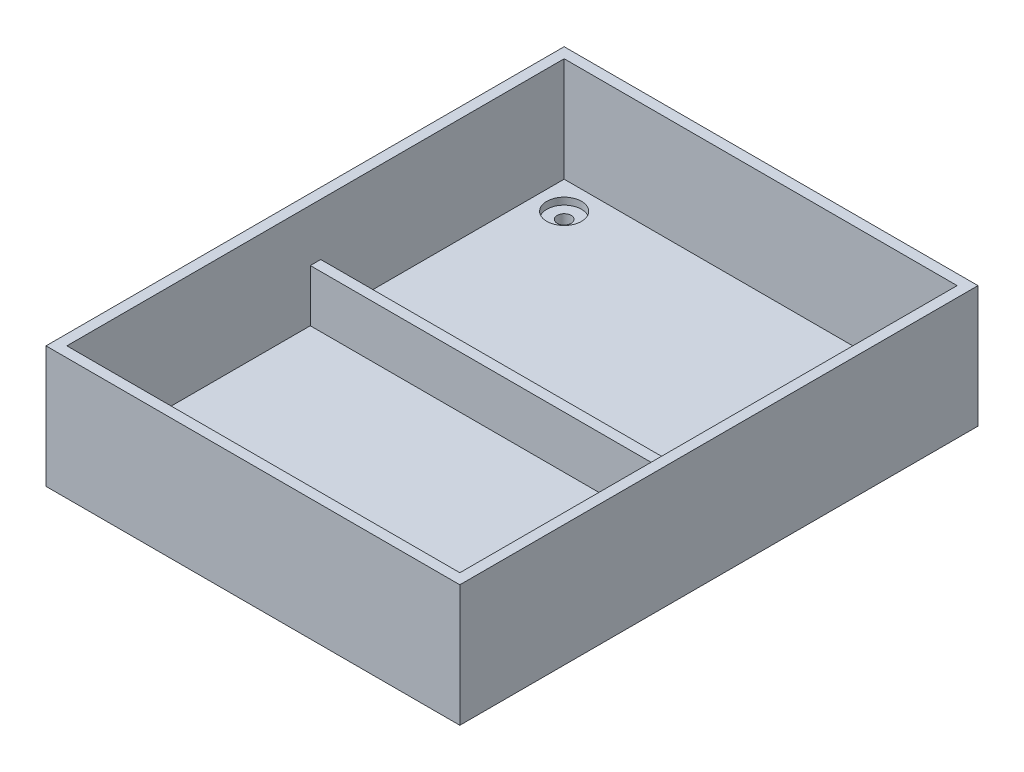
ISO-10303-21;
HEADER;
FILE_DESCRIPTION(('STEP AP214'),'2;1');
FILE_NAME('part.step','',(''),(''),'','','');
FILE_SCHEMA(('AUTOMOTIVE_DESIGN { 1 0 10303 214 1 1 1 1 }'));
ENDSEC;
DATA;
#1=APPLICATION_CONTEXT('core data for automotive mechanical design processes');
#2=APPLICATION_PROTOCOL_DEFINITION('international standard','automotive_design',2000,#1);
#3=PRODUCT_CONTEXT('',#1,'mechanical');
#4=PRODUCT('Part','Part','',(#3));
#5=PRODUCT_RELATED_PRODUCT_CATEGORY('part','',(#4));
#6=PRODUCT_DEFINITION_FORMATION('','',#4);
#7=PRODUCT_DEFINITION_CONTEXT('part definition',#1,'design');
#8=PRODUCT_DEFINITION('design','',#6,#7);
#9=PRODUCT_DEFINITION_SHAPE('','',#8);
#10=(LENGTH_UNIT() NAMED_UNIT(*) SI_UNIT(.MILLI.,.METRE.));
#11=(NAMED_UNIT(*) PLANE_ANGLE_UNIT() SI_UNIT($,.RADIAN.));
#12=(NAMED_UNIT(*) SI_UNIT($,.STERADIAN.) SOLID_ANGLE_UNIT());
#13=UNCERTAINTY_MEASURE_WITH_UNIT(LENGTH_MEASURE(1.E-05),#10,'distance_accuracy_value','');
#14=(GEOMETRIC_REPRESENTATION_CONTEXT(3) GLOBAL_UNCERTAINTY_ASSIGNED_CONTEXT((#13)) GLOBAL_UNIT_ASSIGNED_CONTEXT((#10,
#11,#12)) REPRESENTATION_CONTEXT('',''));
#15=CARTESIAN_POINT('',(0.,0.,0.));
#16=DIRECTION('',(0.,0.,1.));
#17=DIRECTION('',(1.,0.,0.));
#18=AXIS2_PLACEMENT_3D('',#15,#16,#17);
#19=CARTESIAN_POINT('',(-63.5,35.,35.));
#20=DIRECTION('',(0.,0.,-1.));
#21=DIRECTION('',(-1.,0.,0.));
#22=AXIS2_PLACEMENT_3D('',#19,#20,#21);
#23=PLANE('',#22);
#24=DIRECTION('',(0.,-1.,0.));
#25=VECTOR('',#24,1.);
#26=CARTESIAN_POINT('',(-63.5,35.,35.));
#27=LINE('',#26,#25);
#28=CARTESIAN_POINT('',(-63.5,20.,35.));
#29=VERTEX_POINT('',#28);
#30=CARTESIAN_POINT('',(-63.5,5.,35.));
#31=VERTEX_POINT('',#30);
#32=EDGE_CURVE('E200',#29,#31,#27,.T.);
#33=ORIENTED_EDGE('',*,*,#32,.F.);
#34=DIRECTION('',(-1.,0.,0.));
#35=VECTOR('',#34,1.);
#36=CARTESIAN_POINT('',(-63.5,20.,35.));
#37=LINE('',#36,#35);
#38=CARTESIAN_POINT('',(49.5,20.,35.));
#39=VERTEX_POINT('',#38);
#40=EDGE_CURVE('E139',#39,#29,#37,.T.);
#41=ORIENTED_EDGE('',*,*,#40,.F.);
#42=DIRECTION('',(0.,-1.,0.));
#43=VECTOR('',#42,1.);
#44=CARTESIAN_POINT('',(49.5,35.,35.));
#45=LINE('',#44,#43);
#46=CARTESIAN_POINT('',(49.5,5.,35.));
#47=VERTEX_POINT('',#46);
#48=EDGE_CURVE('E136',#39,#47,#45,.T.);
#49=ORIENTED_EDGE('',*,*,#48,.T.);
#50=DIRECTION('',(1.,0.,0.));
#51=VECTOR('',#50,1.);
#52=CARTESIAN_POINT('',(-63.5,5.,35.));
#53=LINE('',#52,#51);
#54=EDGE_CURVE('E182',#31,#47,#53,.T.);
#55=ORIENTED_EDGE('',*,*,#54,.F.);
#56=EDGE_LOOP('',(#33,#41,#49,#55));
#57=FACE_BOUND('',#56,.T.);
#58=ADVANCED_FACE('F36',(#57),#23,.T.);
#59=CARTESIAN_POINT('',(-63.5,35.,38.));
#60=DIRECTION('',(0.,0.,1.));
#61=DIRECTION('',(1.,0.,0.));
#62=AXIS2_PLACEMENT_3D('',#59,#60,#61);
#63=PLANE('',#62);
#64=DIRECTION('',(0.,-1.,0.));
#65=VECTOR('',#64,1.);
#66=CARTESIAN_POINT('',(49.5,35.,38.));
#67=LINE('',#66,#65);
#68=CARTESIAN_POINT('',(49.5,20.,38.));
#69=VERTEX_POINT('',#68);
#70=CARTESIAN_POINT('',(49.5,5.,38.));
#71=VERTEX_POINT('',#70);
#72=EDGE_CURVE('E134',#69,#71,#67,.T.);
#73=ORIENTED_EDGE('',*,*,#72,.F.);
#74=DIRECTION('',(1.,0.,0.));
#75=VECTOR('',#74,1.);
#76=CARTESIAN_POINT('',(-63.5,20.,38.));
#77=LINE('',#76,#75);
#78=CARTESIAN_POINT('',(-63.5,20.,38.));
#79=VERTEX_POINT('',#78);
#80=EDGE_CURVE('E140',#79,#69,#77,.T.);
#81=ORIENTED_EDGE('',*,*,#80,.F.);
#82=DIRECTION('',(0.,-1.,0.));
#83=VECTOR('',#82,1.);
#84=CARTESIAN_POINT('',(-63.5,35.,38.));
#85=LINE('',#84,#83);
#86=CARTESIAN_POINT('',(-63.5,5.,38.));
#87=VERTEX_POINT('',#86);
#88=EDGE_CURVE('E153',#79,#87,#85,.T.);
#89=ORIENTED_EDGE('',*,*,#88,.T.);
#90=DIRECTION('',(-1.,0.,0.));
#91=VECTOR('',#90,1.);
#92=CARTESIAN_POINT('',(-63.5,5.,38.));
#93=LINE('',#92,#91);
#94=EDGE_CURVE('E149',#71,#87,#93,.T.);
#95=ORIENTED_EDGE('',*,*,#94,.F.);
#96=EDGE_LOOP('',(#73,#81,#89,#95));
#97=FACE_BOUND('',#96,.T.);
#98=ADVANCED_FACE('F147',(#97),#63,.T.);
#99=CARTESIAN_POINT('',(-66.5,5.,-38.));
#100=DIRECTION('',(0.,0.,1.));
#101=DIRECTION('',(1.,0.,0.));
#102=AXIS2_PLACEMENT_3D('',#99,#100,#101);
#103=PLANE('',#102);
#104=DIRECTION('',(-1.,0.,0.));
#105=VECTOR('',#104,1.);
#106=CARTESIAN_POINT('',(-66.5,0.,-38.));
#107=LINE('',#106,#105);
#108=CARTESIAN_POINT('',(52.5,0.,-38.));
#109=VERTEX_POINT('',#108);
#110=CARTESIAN_POINT('',(-66.5,0.,-38.));
#111=VERTEX_POINT('',#110);
#112=EDGE_CURVE('E219',#109,#111,#107,.T.);
#113=ORIENTED_EDGE('',*,*,#112,.T.);
#114=DIRECTION('',(0.,-1.,0.));
#115=VECTOR('',#114,1.);
#116=CARTESIAN_POINT('',(-66.5,5.,-38.));
#117=LINE('',#116,#115);
#118=CARTESIAN_POINT('',(-66.5,35.,-38.));
#119=VERTEX_POINT('',#118);
#120=EDGE_CURVE('E11',#119,#111,#117,.T.);
#121=ORIENTED_EDGE('',*,*,#120,.F.);
#122=DIRECTION('',(-1.,0.,0.));
#123=VECTOR('',#122,1.);
#124=CARTESIAN_POINT('',(-66.5,35.,-38.));
#125=LINE('',#124,#123);
#126=CARTESIAN_POINT('',(52.5,35.,-38.));
#127=VERTEX_POINT('',#126);
#128=EDGE_CURVE('E215',#127,#119,#125,.T.);
#129=ORIENTED_EDGE('',*,*,#128,.F.);
#130=DIRECTION('',(0.,-1.,0.));
#131=VECTOR('',#130,1.);
#132=CARTESIAN_POINT('',(52.5,5.,-38.));
#133=LINE('',#132,#131);
#134=EDGE_CURVE('E232',#127,#109,#133,.T.);
#135=ORIENTED_EDGE('',*,*,#134,.T.);
#136=EDGE_LOOP('',(#113,#121,#129,#135));
#137=FACE_BOUND('',#136,.T.);
#138=ADVANCED_FACE('F38',(#137),#103,.F.);
#139=CARTESIAN_POINT('',(-66.5,5.,111.));
#140=DIRECTION('',(1.,0.,0.));
#141=DIRECTION('',(0.,0.,-1.));
#142=AXIS2_PLACEMENT_3D('',#139,#140,#141);
#143=PLANE('',#142);
#144=DIRECTION('',(0.,0.,1.));
#145=VECTOR('',#144,1.);
#146=CARTESIAN_POINT('',(-66.5,0.,111.));
#147=LINE('',#146,#145);
#148=CARTESIAN_POINT('',(-66.5,0.,111.));
#149=VERTEX_POINT('',#148);
#150=EDGE_CURVE('E223',#111,#149,#147,.T.);
#151=ORIENTED_EDGE('',*,*,#150,.T.);
#152=DIRECTION('',(0.,-1.,0.));
#153=VECTOR('',#152,1.);
#154=CARTESIAN_POINT('',(-66.5,5.,111.));
#155=LINE('',#154,#153);
#156=CARTESIAN_POINT('',(-66.5,35.,111.));
#157=VERTEX_POINT('',#156);
#158=EDGE_CURVE('E46',#157,#149,#155,.T.);
#159=ORIENTED_EDGE('',*,*,#158,.F.);
#160=DIRECTION('',(0.,0.,1.));
#161=VECTOR('',#160,1.);
#162=CARTESIAN_POINT('',(-66.5,35.,-38.));
#163=LINE('',#162,#161);
#164=EDGE_CURVE('E203',#119,#157,#163,.T.);
#165=ORIENTED_EDGE('',*,*,#164,.F.);
#166=ORIENTED_EDGE('',*,*,#120,.T.);
#167=EDGE_LOOP('',(#151,#159,#165,#166));
#168=FACE_BOUND('',#167,.T.);
#169=ADVANCED_FACE('F351',(#168),#143,.F.);
#170=CARTESIAN_POINT('',(52.5,5.,111.));
#171=DIRECTION('',(0.,0.,-1.));
#172=DIRECTION('',(-1.,0.,0.));
#173=AXIS2_PLACEMENT_3D('',#170,#171,#172);
#174=PLANE('',#173);
#175=DIRECTION('',(1.,0.,0.));
#176=VECTOR('',#175,1.);
#177=CARTESIAN_POINT('',(52.5,0.,111.));
#178=LINE('',#177,#176);
#179=CARTESIAN_POINT('',(52.5,0.,111.));
#180=VERTEX_POINT('',#179);
#181=EDGE_CURVE('E226',#149,#180,#178,.T.);
#182=ORIENTED_EDGE('',*,*,#181,.T.);
#183=DIRECTION('',(0.,-1.,0.));
#184=VECTOR('',#183,1.);
#185=CARTESIAN_POINT('',(52.5,5.,111.));
#186=LINE('',#185,#184);
#187=CARTESIAN_POINT('',(52.5,35.,111.));
#188=VERTEX_POINT('',#187);
#189=EDGE_CURVE('E236',#188,#180,#186,.T.);
#190=ORIENTED_EDGE('',*,*,#189,.F.);
#191=DIRECTION('',(1.,0.,0.));
#192=VECTOR('',#191,1.);
#193=CARTESIAN_POINT('',(-66.5,35.,111.));
#194=LINE('',#193,#192);
#195=EDGE_CURVE('E207',#157,#188,#194,.T.);
#196=ORIENTED_EDGE('',*,*,#195,.F.);
#197=ORIENTED_EDGE('',*,*,#158,.T.);
#198=EDGE_LOOP('',(#182,#190,#196,#197));
#199=FACE_BOUND('',#198,.T.);
#200=ADVANCED_FACE('F348',(#199),#174,.F.);
#201=CARTESIAN_POINT('',(52.5,5.,-38.));
#202=DIRECTION('',(-1.,0.,0.));
#203=DIRECTION('',(0.,0.,1.));
#204=AXIS2_PLACEMENT_3D('',#201,#202,#203);
#205=PLANE('',#204);
#206=DIRECTION('',(0.,0.,-1.));
#207=VECTOR('',#206,1.);
#208=CARTESIAN_POINT('',(52.5,0.,-38.));
#209=LINE('',#208,#207);
#210=EDGE_CURVE('E229',#180,#109,#209,.T.);
#211=ORIENTED_EDGE('',*,*,#210,.T.);
#212=ORIENTED_EDGE('',*,*,#134,.F.);
#213=DIRECTION('',(0.,0.,-1.));
#214=VECTOR('',#213,1.);
#215=CARTESIAN_POINT('',(52.5,35.,-38.));
#216=LINE('',#215,#214);
#217=EDGE_CURVE('E211',#188,#127,#216,.T.);
#218=ORIENTED_EDGE('',*,*,#217,.F.);
#219=ORIENTED_EDGE('',*,*,#189,.T.);
#220=EDGE_LOOP('',(#211,#212,#218,#219));
#221=FACE_BOUND('',#220,.T.);
#222=ADVANCED_FACE('F344',(#221),#205,.F.);
#223=CARTESIAN_POINT('',(0.,0.,0.));
#224=DIRECTION('',(0.,-1.,0.));
#225=DIRECTION('',(0.,0.,-1.));
#226=AXIS2_PLACEMENT_3D('',#223,#224,#225);
#227=PLANE('',#226);
#228=CARTESIAN_POINT('',(-55.5,0.,-27.));
#229=DIRECTION('',(0.,-1.,0.));
#230=DIRECTION('',(0.,0.,-1.));
#231=AXIS2_PLACEMENT_3D('',#228,#229,#230);
#232=CIRCLE('',#231,2.);
#233=CARTESIAN_POINT('',(-55.5,0.,-29.));
#234=VERTEX_POINT('',#233);
#235=EDGE_CURVE('E40',#234,#234,#232,.T.);
#236=ORIENTED_EDGE('',*,*,#235,.F.);
#237=EDGE_LOOP('',(#236));
#238=FACE_BOUND('',#237,.T.);
#239=CARTESIAN_POINT('',(41.5,0.,100.));
#240=DIRECTION('',(0.,-1.,0.));
#241=DIRECTION('',(0.,0.,-1.));
#242=AXIS2_PLACEMENT_3D('',#239,#240,#241);
#243=CIRCLE('',#242,2.);
#244=CARTESIAN_POINT('',(41.5,0.,98.));
#245=VERTEX_POINT('',#244);
#246=EDGE_CURVE('E251',#245,#245,#243,.T.);
#247=ORIENTED_EDGE('',*,*,#246,.F.);
#248=EDGE_LOOP('',(#247));
#249=FACE_BOUND('',#248,.T.);
#250=CARTESIAN_POINT('',(-55.5,0.,100.));
#251=DIRECTION('',(0.,-1.,0.));
#252=DIRECTION('',(0.,0.,-1.));
#253=AXIS2_PLACEMENT_3D('',#250,#251,#252);
#254=CIRCLE('',#253,2.);
#255=CARTESIAN_POINT('',(-55.5,0.,98.));
#256=VERTEX_POINT('',#255);
#257=EDGE_CURVE('E247',#256,#256,#254,.T.);
#258=ORIENTED_EDGE('',*,*,#257,.F.);
#259=EDGE_LOOP('',(#258));
#260=FACE_BOUND('',#259,.T.);
#261=CARTESIAN_POINT('',(41.5,0.,-27.));
#262=DIRECTION('',(0.,-1.,0.));
#263=DIRECTION('',(0.,0.,-1.));
#264=AXIS2_PLACEMENT_3D('',#261,#262,#263);
#265=CIRCLE('',#264,2.);
#266=CARTESIAN_POINT('',(41.5,0.,-29.));
#267=VERTEX_POINT('',#266);
#268=EDGE_CURVE('E243',#267,#267,#265,.T.);
#269=ORIENTED_EDGE('',*,*,#268,.F.);
#270=EDGE_LOOP('',(#269));
#271=FACE_BOUND('',#270,.T.);
#272=ORIENTED_EDGE('',*,*,#112,.F.);
#273=ORIENTED_EDGE('',*,*,#210,.F.);
#274=ORIENTED_EDGE('',*,*,#181,.F.);
#275=ORIENTED_EDGE('',*,*,#150,.F.);
#276=EDGE_LOOP('',(#272,#273,#274,#275));
#277=FACE_BOUND('',#276,.T.);
#278=ADVANCED_FACE('F338',(#238,#249,#260,#271,#277),#227,.T.);
#279=CARTESIAN_POINT('',(0.,35.,0.));
#280=DIRECTION('',(0.,1.,0.));
#281=DIRECTION('',(0.,0.,1.));
#282=AXIS2_PLACEMENT_3D('',#279,#280,#281);
#283=PLANE('',#282);
#284=DIRECTION('',(1.,0.,0.));
#285=VECTOR('',#284,1.);
#286=CARTESIAN_POINT('',(-63.5,35.,108.));
#287=LINE('',#286,#285);
#288=CARTESIAN_POINT('',(-63.5,35.,108.));
#289=VERTEX_POINT('',#288);
#290=CARTESIAN_POINT('',(49.5,35.,108.));
#291=VERTEX_POINT('',#290);
#292=EDGE_CURVE('E160',#289,#291,#287,.T.);
#293=ORIENTED_EDGE('',*,*,#292,.F.);
#294=DIRECTION('',(0.,0.,1.));
#295=VECTOR('',#294,1.);
#296=CARTESIAN_POINT('',(-63.5,35.,-35.));
#297=LINE('',#296,#295);
#298=CARTESIAN_POINT('',(-63.5,35.,-35.));
#299=VERTEX_POINT('',#298);
#300=EDGE_CURVE('E168',#299,#289,#297,.T.);
#301=ORIENTED_EDGE('',*,*,#300,.F.);
#302=DIRECTION('',(-1.,0.,0.));
#303=VECTOR('',#302,1.);
#304=CARTESIAN_POINT('',(-63.5,35.,-35.));
#305=LINE('',#304,#303);
#306=CARTESIAN_POINT('',(49.5,35.,-35.));
#307=VERTEX_POINT('',#306);
#308=EDGE_CURVE('E176',#307,#299,#305,.T.);
#309=ORIENTED_EDGE('',*,*,#308,.F.);
#310=DIRECTION('',(0.,0.,-1.));
#311=VECTOR('',#310,1.);
#312=CARTESIAN_POINT('',(49.5,35.,-35.));
#313=LINE('',#312,#311);
#314=EDGE_CURVE('E171',#291,#307,#313,.T.);
#315=ORIENTED_EDGE('',*,*,#314,.F.);
#316=EDGE_LOOP('',(#293,#301,#309,#315));
#317=FACE_BOUND('',#316,.T.);
#318=ORIENTED_EDGE('',*,*,#164,.T.);
#319=ORIENTED_EDGE('',*,*,#195,.T.);
#320=ORIENTED_EDGE('',*,*,#217,.T.);
#321=ORIENTED_EDGE('',*,*,#128,.T.);
#322=EDGE_LOOP('',(#318,#319,#320,#321));
#323=FACE_BOUND('',#322,.T.);
#324=ADVANCED_FACE('F315',(#317,#323),#283,.T.);
#325=CARTESIAN_POINT('',(-63.5,35.,-35.));
#326=DIRECTION('',(1.,0.,0.));
#327=DIRECTION('',(0.,0.,-1.));
#328=AXIS2_PLACEMENT_3D('',#325,#326,#327);
#329=PLANE('',#328);
#330=DIRECTION('',(0.,0.,1.));
#331=VECTOR('',#330,1.);
#332=CARTESIAN_POINT('',(-63.5,5.,-35.));
#333=LINE('',#332,#331);
#334=CARTESIAN_POINT('',(-63.5,5.,-35.));
#335=VERTEX_POINT('',#334);
#336=EDGE_CURVE('E167',#335,#31,#333,.T.);
#337=ORIENTED_EDGE('',*,*,#336,.F.);
#338=DIRECTION('',(0.,-1.,0.));
#339=VECTOR('',#338,1.);
#340=CARTESIAN_POINT('',(-63.5,35.,-35.));
#341=LINE('',#340,#339);
#342=EDGE_CURVE('E62',#299,#335,#341,.T.);
#343=ORIENTED_EDGE('',*,*,#342,.F.);
#344=ORIENTED_EDGE('',*,*,#300,.T.);
#345=DIRECTION('',(0.,-1.,0.));
#346=VECTOR('',#345,1.);
#347=CARTESIAN_POINT('',(-63.5,35.,108.));
#348=LINE('',#347,#346);
#349=CARTESIAN_POINT('',(-63.5,5.,108.));
#350=VERTEX_POINT('',#349);
#351=EDGE_CURVE('E158',#289,#350,#348,.T.);
#352=ORIENTED_EDGE('',*,*,#351,.T.);
#353=DIRECTION('',(0.,0.,1.));
#354=VECTOR('',#353,1.);
#355=CARTESIAN_POINT('',(-63.5,5.,108.));
#356=LINE('',#355,#354);
#357=EDGE_CURVE('E289',#87,#350,#356,.T.);
#358=ORIENTED_EDGE('',*,*,#357,.F.);
#359=ORIENTED_EDGE('',*,*,#88,.F.);
#360=DIRECTION('',(0.,0.,1.));
#361=VECTOR('',#360,1.);
#362=CARTESIAN_POINT('',(-63.5,20.,35.));
#363=LINE('',#362,#361);
#364=EDGE_CURVE('E54',#29,#79,#363,.T.);
#365=ORIENTED_EDGE('',*,*,#364,.F.);
#366=ORIENTED_EDGE('',*,*,#32,.T.);
#367=EDGE_LOOP('',(#337,#343,#344,#352,#358,#359,#365,#366));
#368=FACE_BOUND('',#367,.T.);
#369=ADVANCED_FACE('F319',(#368),#329,.T.);
#370=CARTESIAN_POINT('',(49.5,35.,-35.));
#371=DIRECTION('',(-1.,0.,0.));
#372=DIRECTION('',(0.,0.,1.));
#373=AXIS2_PLACEMENT_3D('',#370,#371,#372);
#374=PLANE('',#373);
#375=DIRECTION('',(0.,0.,-1.));
#376=VECTOR('',#375,1.);
#377=CARTESIAN_POINT('',(49.5,5.,-35.));
#378=LINE('',#377,#376);
#379=CARTESIAN_POINT('',(49.5,5.,-35.));
#380=VERTEX_POINT('',#379);
#381=EDGE_CURVE('E186',#47,#380,#378,.T.);
#382=ORIENTED_EDGE('',*,*,#381,.F.);
#383=ORIENTED_EDGE('',*,*,#48,.F.);
#384=DIRECTION('',(0.,0.,-1.));
#385=VECTOR('',#384,1.);
#386=CARTESIAN_POINT('',(49.5,20.,35.));
#387=LINE('',#386,#385);
#388=EDGE_CURVE('E129',#69,#39,#387,.T.);
#389=ORIENTED_EDGE('',*,*,#388,.F.);
#390=ORIENTED_EDGE('',*,*,#72,.T.);
#391=DIRECTION('',(0.,0.,-1.));
#392=VECTOR('',#391,1.);
#393=CARTESIAN_POINT('',(49.5,5.,108.));
#394=LINE('',#393,#392);
#395=CARTESIAN_POINT('',(49.5,5.,108.));
#396=VERTEX_POINT('',#395);
#397=EDGE_CURVE('E300',#396,#71,#394,.T.);
#398=ORIENTED_EDGE('',*,*,#397,.F.);
#399=DIRECTION('',(0.,-1.,0.));
#400=VECTOR('',#399,1.);
#401=CARTESIAN_POINT('',(49.5,35.,108.));
#402=LINE('',#401,#400);
#403=EDGE_CURVE('E152',#291,#396,#402,.T.);
#404=ORIENTED_EDGE('',*,*,#403,.F.);
#405=ORIENTED_EDGE('',*,*,#314,.T.);
#406=DIRECTION('',(0.,-1.,0.));
#407=VECTOR('',#406,1.);
#408=CARTESIAN_POINT('',(49.5,35.,-35.));
#409=LINE('',#408,#407);
#410=EDGE_CURVE('E195',#307,#380,#409,.T.);
#411=ORIENTED_EDGE('',*,*,#410,.T.);
#412=EDGE_LOOP('',(#382,#383,#389,#390,#398,#404,#405,#411));
#413=FACE_BOUND('',#412,.T.);
#414=ADVANCED_FACE('F131',(#413),#374,.T.);
#415=CARTESIAN_POINT('',(-63.5,35.,-35.));
#416=DIRECTION('',(0.,0.,1.));
#417=DIRECTION('',(1.,0.,0.));
#418=AXIS2_PLACEMENT_3D('',#415,#416,#417);
#419=PLANE('',#418);
#420=DIRECTION('',(-1.,0.,0.));
#421=VECTOR('',#420,1.);
#422=CARTESIAN_POINT('',(-63.5,5.,-35.));
#423=LINE('',#422,#421);
#424=EDGE_CURVE('E172',#380,#335,#423,.T.);
#425=ORIENTED_EDGE('',*,*,#424,.F.);
#426=ORIENTED_EDGE('',*,*,#410,.F.);
#427=ORIENTED_EDGE('',*,*,#308,.T.);
#428=ORIENTED_EDGE('',*,*,#342,.T.);
#429=EDGE_LOOP('',(#425,#426,#427,#428));
#430=FACE_BOUND('',#429,.T.);
#431=ADVANCED_FACE('F317',(#430),#419,.T.);
#432=CARTESIAN_POINT('',(-63.5,35.,108.));
#433=DIRECTION('',(0.,0.,-1.));
#434=DIRECTION('',(-1.,0.,0.));
#435=AXIS2_PLACEMENT_3D('',#432,#433,#434);
#436=PLANE('',#435);
#437=DIRECTION('',(1.,0.,0.));
#438=VECTOR('',#437,1.);
#439=CARTESIAN_POINT('',(-63.5,5.,108.));
#440=LINE('',#439,#438);
#441=EDGE_CURVE('E296',#350,#396,#440,.T.);
#442=ORIENTED_EDGE('',*,*,#441,.F.);
#443=ORIENTED_EDGE('',*,*,#351,.F.);
#444=ORIENTED_EDGE('',*,*,#292,.T.);
#445=ORIENTED_EDGE('',*,*,#403,.T.);
#446=EDGE_LOOP('',(#442,#443,#444,#445));
#447=FACE_BOUND('',#446,.T.);
#448=ADVANCED_FACE('F310',(#447),#436,.T.);
#449=CARTESIAN_POINT('',(0.,5.,0.));
#450=DIRECTION('',(0.,-1.,0.));
#451=DIRECTION('',(0.,0.,-1.));
#452=AXIS2_PLACEMENT_3D('',#449,#450,#451);
#453=PLANE('',#452);
#454=CARTESIAN_POINT('',(41.5,5.,-27.));
#455=DIRECTION('',(0.,1.,0.));
#456=DIRECTION('',(0.,0.,-1.));
#457=AXIS2_PLACEMENT_3D('',#454,#455,#456);
#458=CIRCLE('',#457,5.);
#459=CARTESIAN_POINT('',(41.5,5.,-32.));
#460=VERTEX_POINT('',#459);
#461=EDGE_CURVE('E683',#460,#460,#458,.T.);
#462=ORIENTED_EDGE('',*,*,#461,.F.);
#463=EDGE_LOOP('',(#462));
#464=FACE_BOUND('',#463,.T.);
#465=CARTESIAN_POINT('',(-55.5,5.,-27.));
#466=DIRECTION('',(0.,1.,0.));
#467=DIRECTION('',(0.,0.,1.));
#468=AXIS2_PLACEMENT_3D('',#465,#466,#467);
#469=CIRCLE('',#468,5.);
#470=CARTESIAN_POINT('',(-55.5,5.,-22.));
#471=VERTEX_POINT('',#470);
#472=EDGE_CURVE('E280',#471,#471,#469,.T.);
#473=ORIENTED_EDGE('',*,*,#472,.F.);
#474=EDGE_LOOP('',(#473));
#475=FACE_BOUND('',#474,.T.);
#476=ORIENTED_EDGE('',*,*,#424,.T.);
#477=ORIENTED_EDGE('',*,*,#336,.T.);
#478=ORIENTED_EDGE('',*,*,#54,.T.);
#479=ORIENTED_EDGE('',*,*,#381,.T.);
#480=EDGE_LOOP('',(#476,#477,#478,#479));
#481=FACE_BOUND('',#480,.T.);
#482=ADVANCED_FACE('F323',(#464,#475,#481),#453,.F.);
#483=CARTESIAN_POINT('',(-55.5,5.,100.));
#484=DIRECTION('',(0.,1.,0.));
#485=DIRECTION('',(0.,0.,-1.));
#486=AXIS2_PLACEMENT_3D('',#483,#484,#485);
#487=CIRCLE('',#486,5.);
#488=CARTESIAN_POINT('',(-55.5,5.,95.));
#489=VERTEX_POINT('',#488);
#490=EDGE_CURVE('E259',#489,#489,#487,.T.);
#491=ORIENTED_EDGE('',*,*,#490,.F.);
#492=EDGE_LOOP('',(#491));
#493=FACE_BOUND('',#492,.T.);
#494=CARTESIAN_POINT('',(41.5,5.,100.));
#495=DIRECTION('',(0.,1.,0.));
#496=DIRECTION('',(0.,0.,1.));
#497=AXIS2_PLACEMENT_3D('',#494,#495,#496);
#498=CIRCLE('',#497,5.);
#499=CARTESIAN_POINT('',(41.5,5.,105.));
#500=VERTEX_POINT('',#499);
#501=EDGE_CURVE('E272',#500,#500,#498,.T.);
#502=ORIENTED_EDGE('',*,*,#501,.F.);
#503=EDGE_LOOP('',(#502));
#504=FACE_BOUND('',#503,.T.);
#505=ORIENTED_EDGE('',*,*,#94,.T.);
#506=ORIENTED_EDGE('',*,*,#357,.T.);
#507=ORIENTED_EDGE('',*,*,#441,.T.);
#508=ORIENTED_EDGE('',*,*,#397,.T.);
#509=EDGE_LOOP('',(#505,#506,#507,#508));
#510=FACE_BOUND('',#509,.T.);
#511=ADVANCED_FACE('F305',(#493,#504,#510),#453,.F.);
#512=CARTESIAN_POINT('',(0.,20.,0.));
#513=DIRECTION('',(0.,1.,0.));
#514=DIRECTION('',(0.,0.,1.));
#515=AXIS2_PLACEMENT_3D('',#512,#513,#514);
#516=PLANE('',#515);
#517=ORIENTED_EDGE('',*,*,#364,.T.);
#518=ORIENTED_EDGE('',*,*,#80,.T.);
#519=ORIENTED_EDGE('',*,*,#388,.T.);
#520=ORIENTED_EDGE('',*,*,#40,.T.);
#521=EDGE_LOOP('',(#517,#518,#519,#520));
#522=FACE_BOUND('',#521,.T.);
#523=ADVANCED_FACE('F142',(#522),#516,.T.);
#524=CARTESIAN_POINT('',(41.5,3.,100.));
#525=DIRECTION('',(0.,1.,0.));
#526=DIRECTION('',(0.,0.,1.));
#527=AXIS2_PLACEMENT_3D('',#524,#525,#526);
#528=CYLINDRICAL_SURFACE('',#527,5.);
#529=CARTESIAN_POINT('',(41.5,3.,100.));
#530=DIRECTION('',(0.,1.,0.));
#531=DIRECTION('',(0.,0.,1.));
#532=AXIS2_PLACEMENT_3D('',#529,#530,#531);
#533=CIRCLE('',#532,5.);
#534=CARTESIAN_POINT('',(41.5,3.,105.));
#535=VERTEX_POINT('',#534);
#536=EDGE_CURVE('E687',#535,#535,#533,.T.);
#537=ORIENTED_EDGE('',*,*,#536,.F.);
#538=EDGE_LOOP('',(#537));
#539=FACE_BOUND('',#538,.T.);
#540=ORIENTED_EDGE('',*,*,#501,.T.);
#541=EDGE_LOOP('',(#540));
#542=FACE_BOUND('',#541,.T.);
#543=ADVANCED_FACE('F470',(#539,#542),#528,.F.);
#544=CARTESIAN_POINT('',(41.5,3.,100.));
#545=DIRECTION('',(0.,1.,0.));
#546=DIRECTION('',(0.,0.,1.));
#547=AXIS2_PLACEMENT_3D('',#544,#545,#546);
#548=PLANE('',#547);
#549=CARTESIAN_POINT('',(41.5,3.,100.));
#550=DIRECTION('',(0.,1.,0.));
#551=DIRECTION('',(0.,0.,-1.));
#552=AXIS2_PLACEMENT_3D('',#549,#550,#551);
#553=CIRCLE('',#552,2.);
#554=CARTESIAN_POINT('',(41.5,3.,98.));
#555=VERTEX_POINT('',#554);
#556=EDGE_CURVE('E668',#555,#555,#553,.T.);
#557=ORIENTED_EDGE('',*,*,#556,.F.);
#558=EDGE_LOOP('',(#557));
#559=FACE_BOUND('',#558,.T.);
#560=ORIENTED_EDGE('',*,*,#536,.T.);
#561=EDGE_LOOP('',(#560));
#562=FACE_BOUND('',#561,.T.);
#563=ADVANCED_FACE('F476',(#559,#562),#548,.T.);
#564=CARTESIAN_POINT('',(-55.5,3.,100.));
#565=DIRECTION('',(0.,1.,0.));
#566=DIRECTION('',(0.,0.,1.));
#567=AXIS2_PLACEMENT_3D('',#564,#565,#566);
#568=CYLINDRICAL_SURFACE('',#567,5.);
#569=CARTESIAN_POINT('',(-55.5,3.,100.));
#570=DIRECTION('',(0.,1.,0.));
#571=DIRECTION('',(0.,0.,-1.));
#572=AXIS2_PLACEMENT_3D('',#569,#570,#571);
#573=CIRCLE('',#572,5.);
#574=CARTESIAN_POINT('',(-55.5,3.,95.));
#575=VERTEX_POINT('',#574);
#576=EDGE_CURVE('E265',#575,#575,#573,.T.);
#577=ORIENTED_EDGE('',*,*,#576,.F.);
#578=EDGE_LOOP('',(#577));
#579=FACE_BOUND('',#578,.T.);
#580=ORIENTED_EDGE('',*,*,#490,.T.);
#581=EDGE_LOOP('',(#580));
#582=FACE_BOUND('',#581,.T.);
#583=ADVANCED_FACE('F485',(#579,#582),#568,.F.);
#584=CARTESIAN_POINT('',(-55.5,3.,100.));
#585=DIRECTION('',(0.,-1.,0.));
#586=DIRECTION('',(0.,0.,-1.));
#587=AXIS2_PLACEMENT_3D('',#584,#585,#586);
#588=PLANE('',#587);
#589=CARTESIAN_POINT('',(-55.5,3.,100.));
#590=DIRECTION('',(0.,1.,0.));
#591=DIRECTION('',(0.,0.,1.));
#592=AXIS2_PLACEMENT_3D('',#589,#590,#591);
#593=CIRCLE('',#592,2.);
#594=CARTESIAN_POINT('',(-55.5,3.,102.));
#595=VERTEX_POINT('',#594);
#596=EDGE_CURVE('E676',#595,#595,#593,.T.);
#597=ORIENTED_EDGE('',*,*,#596,.F.);
#598=EDGE_LOOP('',(#597));
#599=FACE_BOUND('',#598,.T.);
#600=ORIENTED_EDGE('',*,*,#576,.T.);
#601=EDGE_LOOP('',(#600));
#602=FACE_BOUND('',#601,.T.);
#603=ADVANCED_FACE('F491',(#599,#602),#588,.F.);
#604=CARTESIAN_POINT('',(-55.5,3.,-27.));
#605=DIRECTION('',(0.,1.,0.));
#606=DIRECTION('',(0.,0.,1.));
#607=AXIS2_PLACEMENT_3D('',#604,#605,#606);
#608=CYLINDRICAL_SURFACE('',#607,5.);
#609=CARTESIAN_POINT('',(-55.5,3.,-27.));
#610=DIRECTION('',(0.,1.,0.));
#611=DIRECTION('',(0.,0.,1.));
#612=AXIS2_PLACEMENT_3D('',#609,#610,#611);
#613=CIRCLE('',#612,5.);
#614=CARTESIAN_POINT('',(-55.5,3.,-22.));
#615=VERTEX_POINT('',#614);
#616=EDGE_CURVE('E276',#615,#615,#613,.T.);
#617=ORIENTED_EDGE('',*,*,#616,.F.);
#618=EDGE_LOOP('',(#617));
#619=FACE_BOUND('',#618,.T.);
#620=ORIENTED_EDGE('',*,*,#472,.T.);
#621=EDGE_LOOP('',(#620));
#622=FACE_BOUND('',#621,.T.);
#623=ADVANCED_FACE('F499',(#619,#622),#608,.F.);
#624=CARTESIAN_POINT('',(-55.5,3.,-27.));
#625=DIRECTION('',(0.,1.,0.));
#626=DIRECTION('',(0.,0.,1.));
#627=AXIS2_PLACEMENT_3D('',#624,#625,#626);
#628=PLANE('',#627);
#629=CARTESIAN_POINT('',(-55.5,3.,-27.));
#630=DIRECTION('',(0.,1.,0.));
#631=DIRECTION('',(0.,0.,-1.));
#632=AXIS2_PLACEMENT_3D('',#629,#630,#631);
#633=CIRCLE('',#632,2.);
#634=CARTESIAN_POINT('',(-55.5,3.,-29.));
#635=VERTEX_POINT('',#634);
#636=EDGE_CURVE('E662',#635,#635,#633,.T.);
#637=ORIENTED_EDGE('',*,*,#636,.F.);
#638=EDGE_LOOP('',(#637));
#639=FACE_BOUND('',#638,.T.);
#640=ORIENTED_EDGE('',*,*,#616,.T.);
#641=EDGE_LOOP('',(#640));
#642=FACE_BOUND('',#641,.T.);
#643=ADVANCED_FACE('F504',(#639,#642),#628,.T.);
#644=CARTESIAN_POINT('',(41.5,3.,-27.));
#645=DIRECTION('',(0.,1.,0.));
#646=DIRECTION('',(0.,0.,1.));
#647=AXIS2_PLACEMENT_3D('',#644,#645,#646);
#648=CYLINDRICAL_SURFACE('',#647,5.);
#649=CARTESIAN_POINT('',(41.5,3.,-27.));
#650=DIRECTION('',(0.,1.,0.));
#651=DIRECTION('',(0.,0.,-1.));
#652=AXIS2_PLACEMENT_3D('',#649,#650,#651);
#653=CIRCLE('',#652,5.);
#654=CARTESIAN_POINT('',(41.5,3.,-32.));
#655=VERTEX_POINT('',#654);
#656=EDGE_CURVE('E284',#655,#655,#653,.T.);
#657=ORIENTED_EDGE('',*,*,#656,.F.);
#658=EDGE_LOOP('',(#657));
#659=FACE_BOUND('',#658,.T.);
#660=ORIENTED_EDGE('',*,*,#461,.T.);
#661=EDGE_LOOP('',(#660));
#662=FACE_BOUND('',#661,.T.);
#663=ADVANCED_FACE('F512',(#659,#662),#648,.F.);
#664=CARTESIAN_POINT('',(41.5,3.,-27.));
#665=DIRECTION('',(0.,-1.,0.));
#666=DIRECTION('',(0.,0.,-1.));
#667=AXIS2_PLACEMENT_3D('',#664,#665,#666);
#668=PLANE('',#667);
#669=CARTESIAN_POINT('',(41.5,3.,-27.));
#670=DIRECTION('',(0.,1.,0.));
#671=DIRECTION('',(0.,0.,1.));
#672=AXIS2_PLACEMENT_3D('',#669,#670,#671);
#673=CIRCLE('',#672,2.);
#674=CARTESIAN_POINT('',(41.5,3.,-25.));
#675=VERTEX_POINT('',#674);
#676=EDGE_CURVE('E248',#675,#675,#673,.T.);
#677=ORIENTED_EDGE('',*,*,#676,.F.);
#678=EDGE_LOOP('',(#677));
#679=FACE_BOUND('',#678,.T.);
#680=ORIENTED_EDGE('',*,*,#656,.T.);
#681=EDGE_LOOP('',(#680));
#682=FACE_BOUND('',#681,.T.);
#683=ADVANCED_FACE('F517',(#679,#682),#668,.F.);
#684=CARTESIAN_POINT('',(41.5,-12.,-27.));
#685=DIRECTION('',(0.,1.,0.));
#686=DIRECTION('',(0.,0.,1.));
#687=AXIS2_PLACEMENT_3D('',#684,#685,#686);
#688=CYLINDRICAL_SURFACE('',#687,2.);
#689=ORIENTED_EDGE('',*,*,#268,.T.);
#690=EDGE_LOOP('',(#689));
#691=FACE_BOUND('',#690,.T.);
#692=ORIENTED_EDGE('',*,*,#676,.T.);
#693=EDGE_LOOP('',(#692));
#694=FACE_BOUND('',#693,.T.);
#695=ADVANCED_FACE('F533',(#691,#694),#688,.F.);
#696=CARTESIAN_POINT('',(-55.5,-12.,100.));
#697=DIRECTION('',(0.,1.,0.));
#698=DIRECTION('',(0.,0.,1.));
#699=AXIS2_PLACEMENT_3D('',#696,#697,#698);
#700=CYLINDRICAL_SURFACE('',#699,2.);
#701=ORIENTED_EDGE('',*,*,#257,.T.);
#702=EDGE_LOOP('',(#701));
#703=FACE_BOUND('',#702,.T.);
#704=ORIENTED_EDGE('',*,*,#596,.T.);
#705=EDGE_LOOP('',(#704));
#706=FACE_BOUND('',#705,.T.);
#707=ADVANCED_FACE('F542',(#703,#706),#700,.F.);
#708=CARTESIAN_POINT('',(41.5,-12.,100.));
#709=DIRECTION('',(0.,1.,0.));
#710=DIRECTION('',(0.,0.,1.));
#711=AXIS2_PLACEMENT_3D('',#708,#709,#710);
#712=CYLINDRICAL_SURFACE('',#711,2.);
#713=ORIENTED_EDGE('',*,*,#246,.T.);
#714=EDGE_LOOP('',(#713));
#715=FACE_BOUND('',#714,.T.);
#716=ORIENTED_EDGE('',*,*,#556,.T.);
#717=EDGE_LOOP('',(#716));
#718=FACE_BOUND('',#717,.T.);
#719=ADVANCED_FACE('F552',(#715,#718),#712,.F.);
#720=CARTESIAN_POINT('',(-55.5,-12.,-27.));
#721=DIRECTION('',(0.,1.,0.));
#722=DIRECTION('',(0.,0.,1.));
#723=AXIS2_PLACEMENT_3D('',#720,#721,#722);
#724=CYLINDRICAL_SURFACE('',#723,2.);
#725=ORIENTED_EDGE('',*,*,#235,.T.);
#726=EDGE_LOOP('',(#725));
#727=FACE_BOUND('',#726,.T.);
#728=ORIENTED_EDGE('',*,*,#636,.T.);
#729=EDGE_LOOP('',(#728));
#730=FACE_BOUND('',#729,.T.);
#731=ADVANCED_FACE('F562',(#727,#730),#724,.F.);
#732=CLOSED_SHELL('',(#58,#98,#138,#169,#200,#222,#278,#324,#369,#414,#431,#448,#482,#511,#523,
#543,#563,#583,#603,#623,#643,#663,#683,#695,#707,#719,#731));
#733=MANIFOLD_SOLID_BREP('B2',#732);
#734=ADVANCED_BREP_SHAPE_REPRESENTATION('',(#18,#733),#14);
#735=SHAPE_DEFINITION_REPRESENTATION(#9,#734);
ENDSEC;
END-ISO-10303-21;
